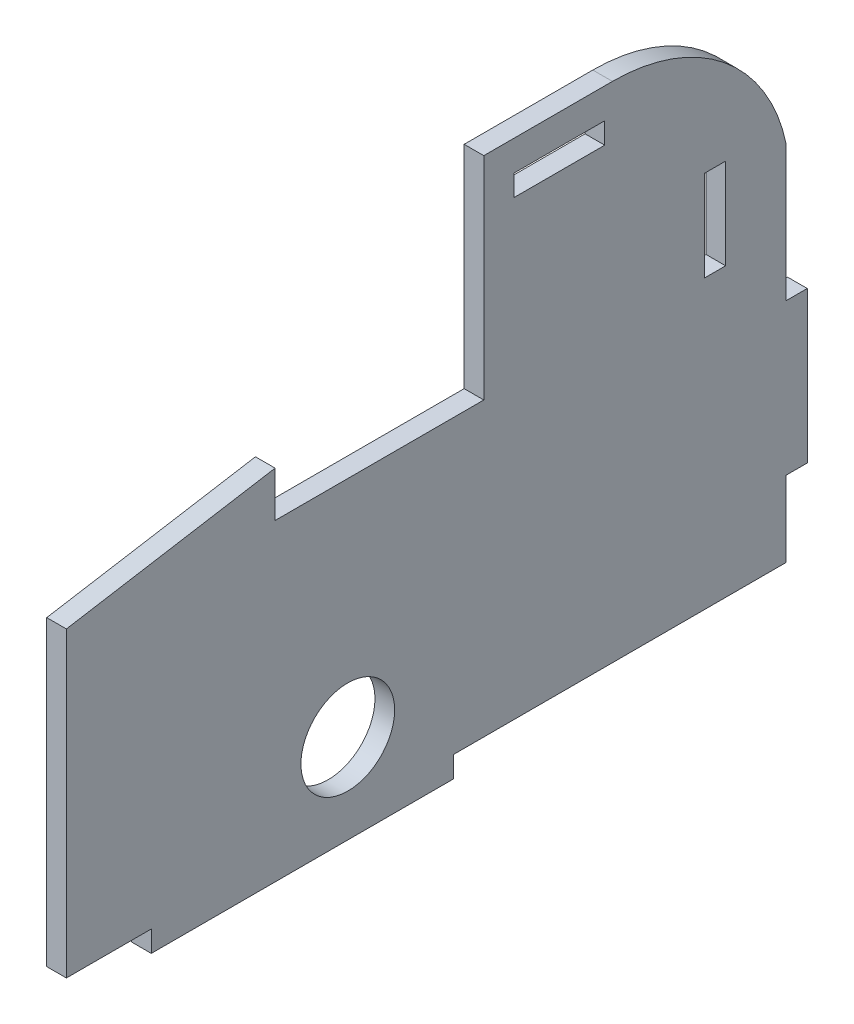
ISO-10303-21;
HEADER;
FILE_DESCRIPTION(('STEP AP214'),'2;1');
FILE_NAME('part.step','',(''),(''),'','','');
FILE_SCHEMA(('AUTOMOTIVE_DESIGN { 1 0 10303 214 1 1 1 1 }'));
ENDSEC;
DATA;
#1=APPLICATION_CONTEXT('core data for automotive mechanical design processes');
#2=APPLICATION_PROTOCOL_DEFINITION('international standard','automotive_design',2000,#1);
#3=PRODUCT_CONTEXT('',#1,'mechanical');
#4=PRODUCT('Part','Part','',(#3));
#5=PRODUCT_RELATED_PRODUCT_CATEGORY('part','',(#4));
#6=PRODUCT_DEFINITION_FORMATION('','',#4);
#7=PRODUCT_DEFINITION_CONTEXT('part definition',#1,'design');
#8=PRODUCT_DEFINITION('design','',#6,#7);
#9=PRODUCT_DEFINITION_SHAPE('','',#8);
#10=(LENGTH_UNIT() NAMED_UNIT(*) SI_UNIT(.MILLI.,.METRE.));
#11=(NAMED_UNIT(*) PLANE_ANGLE_UNIT() SI_UNIT($,.RADIAN.));
#12=(NAMED_UNIT(*) SI_UNIT($,.STERADIAN.) SOLID_ANGLE_UNIT());
#13=UNCERTAINTY_MEASURE_WITH_UNIT(LENGTH_MEASURE(1.E-05),#10,'distance_accuracy_value','');
#14=(GEOMETRIC_REPRESENTATION_CONTEXT(3) GLOBAL_UNCERTAINTY_ASSIGNED_CONTEXT((#13)) GLOBAL_UNIT_ASSIGNED_CONTEXT((#10,
#11,#12)) REPRESENTATION_CONTEXT('',''));
#15=CARTESIAN_POINT('',(0.,0.,0.));
#16=DIRECTION('',(0.,0.,1.));
#17=DIRECTION('',(1.,0.,0.));
#18=AXIS2_PLACEMENT_3D('',#15,#16,#17);
#19=CARTESIAN_POINT('',(1.3,24.,-16.3874151755906));
#20=DIRECTION('',(0.,0.,1.));
#21=DIRECTION('',(1.,0.,0.));
#22=AXIS2_PLACEMENT_3D('',#19,#20,#21);
#23=PLANE('',#22);
#24=DIRECTION('',(1.,0.,0.));
#25=VECTOR('',#24,1.);
#26=CARTESIAN_POINT('',(0.,15.,-16.3874151755906));
#27=LINE('',#26,#25);
#28=CARTESIAN_POINT('',(0.,15.,-16.3874151755906));
#29=VERTEX_POINT('',#28);
#30=CARTESIAN_POINT('',(1.3,15.,-16.3874151755906));
#31=VERTEX_POINT('',#30);
#32=EDGE_CURVE('E246',#29,#31,#27,.T.);
#33=ORIENTED_EDGE('',*,*,#32,.F.);
#34=DIRECTION('',(0.,1.,0.));
#35=VECTOR('',#34,1.);
#36=CARTESIAN_POINT('',(0.,24.,-16.3874151755906));
#37=LINE('',#36,#35);
#38=CARTESIAN_POINT('',(0.,24.,-16.3874151755906));
#39=VERTEX_POINT('',#38);
#40=EDGE_CURVE('E359',#29,#39,#37,.T.);
#41=ORIENTED_EDGE('',*,*,#40,.T.);
#42=DIRECTION('',(-1.,0.,0.));
#43=VECTOR('',#42,1.);
#44=CARTESIAN_POINT('',(1.3,24.,-16.3874151755906));
#45=LINE('',#44,#43);
#46=CARTESIAN_POINT('',(1.3,24.,-16.3874151755906));
#47=VERTEX_POINT('',#46);
#48=EDGE_CURVE('E48',#47,#39,#45,.T.);
#49=ORIENTED_EDGE('',*,*,#48,.F.);
#50=DIRECTION('',(0.,1.,0.));
#51=VECTOR('',#50,1.);
#52=CARTESIAN_POINT('',(1.3,24.,-16.3874151755906));
#53=LINE('',#52,#51);
#54=EDGE_CURVE('E336',#31,#47,#53,.T.);
#55=ORIENTED_EDGE('',*,*,#54,.F.);
#56=EDGE_LOOP('',(#33,#41,#49,#55));
#57=FACE_BOUND('',#56,.T.);
#58=ADVANCED_FACE('F40',(#57),#23,.F.);
#59=CARTESIAN_POINT('',(1.3,0.,-16.3874151755906));
#60=DIRECTION('',(0.,1.,0.));
#61=DIRECTION('',(0.,0.,1.));
#62=AXIS2_PLACEMENT_3D('',#59,#60,#61);
#63=PLANE('',#62);
#64=DIRECTION('',(1.,0.,0.));
#65=VECTOR('',#64,1.);
#66=CARTESIAN_POINT('',(0.,0.,5.61258482440937));
#67=LINE('',#66,#65);
#68=CARTESIAN_POINT('',(0.,0.,5.61258482440937));
#69=VERTEX_POINT('',#68);
#70=CARTESIAN_POINT('',(1.3,0.,5.61258482440937));
#71=VERTEX_POINT('',#70);
#72=EDGE_CURVE('E328',#69,#71,#67,.T.);
#73=ORIENTED_EDGE('',*,*,#72,.F.);
#74=DIRECTION('',(0.,0.,-1.));
#75=VECTOR('',#74,1.);
#76=CARTESIAN_POINT('',(0.,0.,-16.3874151755906));
#77=LINE('',#76,#75);
#78=CARTESIAN_POINT('',(0.,0.,-16.3874151755906));
#79=VERTEX_POINT('',#78);
#80=EDGE_CURVE('E327',#69,#79,#77,.T.);
#81=ORIENTED_EDGE('',*,*,#80,.T.);
#82=DIRECTION('',(-1.,0.,0.));
#83=VECTOR('',#82,1.);
#84=CARTESIAN_POINT('',(1.3,0.,-16.3874151755906));
#85=LINE('',#84,#83);
#86=CARTESIAN_POINT('',(1.3,0.,-16.3874151755906));
#87=VERTEX_POINT('',#86);
#88=EDGE_CURVE('E11',#87,#79,#85,.T.);
#89=ORIENTED_EDGE('',*,*,#88,.F.);
#90=DIRECTION('',(0.,0.,-1.));
#91=VECTOR('',#90,1.);
#92=CARTESIAN_POINT('',(1.3,0.,0.));
#93=LINE('',#92,#91);
#94=EDGE_CURVE('E337',#71,#87,#93,.T.);
#95=ORIENTED_EDGE('',*,*,#94,.F.);
#96=EDGE_LOOP('',(#73,#81,#89,#95));
#97=FACE_BOUND('',#96,.T.);
#98=ADVANCED_FACE('F443',(#97),#63,.F.);
#99=CARTESIAN_POINT('',(0.,0.,31.2285816674518));
#100=VERTEX_POINT('',#99);
#101=CARTESIAN_POINT('',(0.,0.,25.6125848244094));
#102=VERTEX_POINT('',#101);
#103=EDGE_CURVE('E356',#100,#102,#77,.T.);
#104=ORIENTED_EDGE('',*,*,#103,.T.);
#105=DIRECTION('',(1.,0.,0.));
#106=VECTOR('',#105,1.);
#107=CARTESIAN_POINT('',(0.,0.,25.6125848244094));
#108=LINE('',#107,#106);
#109=CARTESIAN_POINT('',(1.3,0.,25.6125848244094));
#110=VERTEX_POINT('',#109);
#111=EDGE_CURVE('E324',#102,#110,#108,.T.);
#112=ORIENTED_EDGE('',*,*,#111,.T.);
#113=CARTESIAN_POINT('',(1.3,0.,31.2285816674518));
#114=VERTEX_POINT('',#113);
#115=EDGE_CURVE('E333',#114,#110,#93,.T.);
#116=ORIENTED_EDGE('',*,*,#115,.F.);
#117=DIRECTION('',(-1.,0.,0.));
#118=VECTOR('',#117,1.);
#119=CARTESIAN_POINT('',(1.3,0.,31.2285816674518));
#120=LINE('',#119,#118);
#121=EDGE_CURVE('E355',#114,#100,#120,.T.);
#122=ORIENTED_EDGE('',*,*,#121,.T.);
#123=EDGE_LOOP('',(#104,#112,#116,#122));
#124=FACE_BOUND('',#123,.T.);
#125=ADVANCED_FACE('F42',(#124),#63,.F.);
#126=CARTESIAN_POINT('',(0.,5.,-16.3874151755906));
#127=VERTEX_POINT('',#126);
#128=EDGE_CURVE('E360',#79,#127,#37,.T.);
#129=ORIENTED_EDGE('',*,*,#128,.T.);
#130=DIRECTION('',(1.,0.,0.));
#131=VECTOR('',#130,1.);
#132=CARTESIAN_POINT('',(0.,5.,-16.3874151755906));
#133=LINE('',#132,#131);
#134=CARTESIAN_POINT('',(1.3,5.,-16.3874151755906));
#135=VERTEX_POINT('',#134);
#136=EDGE_CURVE('E281',#127,#135,#133,.T.);
#137=ORIENTED_EDGE('',*,*,#136,.T.);
#138=EDGE_CURVE('E338',#87,#135,#53,.T.);
#139=ORIENTED_EDGE('',*,*,#138,.F.);
#140=ORIENTED_EDGE('',*,*,#88,.T.);
#141=EDGE_LOOP('',(#129,#137,#139,#140));
#142=FACE_BOUND('',#141,.T.);
#143=ADVANCED_FACE('F437',(#142),#23,.F.);
#144=CARTESIAN_POINT('',(1.3,21.5670962182213,-4.89861968911437));
#145=DIRECTION('',(-1.,0.,0.));
#146=DIRECTION('',(0.,0.,1.));
#147=AXIS2_PLACEMENT_3D('',#144,#145,#146);
#148=CYLINDRICAL_SURFACE('',#147,11.7435702638282);
#149=CARTESIAN_POINT('',(0.,21.5670962182213,-4.89861968911437));
#150=DIRECTION('',(1.,0.,0.));
#151=DIRECTION('',(0.,0.,1.));
#152=AXIS2_PLACEMENT_3D('',#149,#150,#151);
#153=CIRCLE('',#152,11.7435702638282);
#154=CARTESIAN_POINT('',(0.,33.3106664820495,-4.89861968911437));
#155=VERTEX_POINT('',#154);
#156=EDGE_CURVE('E363',#39,#155,#153,.T.);
#157=ORIENTED_EDGE('',*,*,#156,.T.);
#158=DIRECTION('',(-1.,0.,0.));
#159=VECTOR('',#158,1.);
#160=CARTESIAN_POINT('',(1.3,33.3106664820495,-4.89861968911437));
#161=LINE('',#160,#159);
#162=CARTESIAN_POINT('',(1.3,33.3106664820495,-4.89861968911437));
#163=VERTEX_POINT('',#162);
#164=EDGE_CURVE('E395',#163,#155,#161,.T.);
#165=ORIENTED_EDGE('',*,*,#164,.F.);
#166=CARTESIAN_POINT('',(1.3,21.5670962182213,-4.89861968911437));
#167=DIRECTION('',(1.,0.,0.));
#168=DIRECTION('',(0.,0.,1.));
#169=AXIS2_PLACEMENT_3D('',#166,#167,#168);
#170=CIRCLE('',#169,11.7435702638282);
#171=EDGE_CURVE('E341',#47,#163,#170,.T.);
#172=ORIENTED_EDGE('',*,*,#171,.F.);
#173=ORIENTED_EDGE('',*,*,#48,.T.);
#174=EDGE_LOOP('',(#157,#165,#172,#173));
#175=FACE_BOUND('',#174,.T.);
#176=ADVANCED_FACE('F402',(#175),#148,.T.);
#177=CARTESIAN_POINT('',(1.3,33.3106664820495,3.61258482440937));
#178=DIRECTION('',(0.,-1.,0.));
#179=DIRECTION('',(0.,0.,-1.));
#180=AXIS2_PLACEMENT_3D('',#177,#178,#179);
#181=PLANE('',#180);
#182=DIRECTION('',(0.,0.,1.));
#183=VECTOR('',#182,1.);
#184=CARTESIAN_POINT('',(0.,33.3106664820495,3.61258482440937));
#185=LINE('',#184,#183);
#186=CARTESIAN_POINT('',(0.,33.3106664820495,3.61258482440937));
#187=VERTEX_POINT('',#186);
#188=EDGE_CURVE('E365',#155,#187,#185,.T.);
#189=ORIENTED_EDGE('',*,*,#188,.T.);
#190=DIRECTION('',(-1.,0.,0.));
#191=VECTOR('',#190,1.);
#192=CARTESIAN_POINT('',(1.3,33.3106664820495,3.61258482440937));
#193=LINE('',#192,#191);
#194=CARTESIAN_POINT('',(1.3,33.3106664820495,3.61258482440937));
#195=VERTEX_POINT('',#194);
#196=EDGE_CURVE('E392',#195,#187,#193,.T.);
#197=ORIENTED_EDGE('',*,*,#196,.F.);
#198=DIRECTION('',(0.,0.,1.));
#199=VECTOR('',#198,1.);
#200=CARTESIAN_POINT('',(1.3,33.3106664820495,3.61258482440937));
#201=LINE('',#200,#199);
#202=EDGE_CURVE('E343',#163,#195,#201,.T.);
#203=ORIENTED_EDGE('',*,*,#202,.F.);
#204=ORIENTED_EDGE('',*,*,#164,.T.);
#205=EDGE_LOOP('',(#189,#197,#203,#204));
#206=FACE_BOUND('',#205,.T.);
#207=ADVANCED_FACE('F414',(#206),#181,.F.);
#208=CARTESIAN_POINT('',(1.3,19.3106664820495,3.61258482440937));
#209=DIRECTION('',(0.,0.,-1.));
#210=DIRECTION('',(0.,1.,0.));
#211=AXIS2_PLACEMENT_3D('',#208,#209,#210);
#212=PLANE('',#211);
#213=DIRECTION('',(0.,-1.,0.));
#214=VECTOR('',#213,1.);
#215=CARTESIAN_POINT('',(0.,19.3106664820495,3.61258482440937));
#216=LINE('',#215,#214);
#217=CARTESIAN_POINT('',(0.,19.3106664820495,3.61258482440937));
#218=VERTEX_POINT('',#217);
#219=EDGE_CURVE('E367',#187,#218,#216,.T.);
#220=ORIENTED_EDGE('',*,*,#219,.T.);
#221=DIRECTION('',(-1.,0.,0.));
#222=VECTOR('',#221,1.);
#223=CARTESIAN_POINT('',(1.3,19.3106664820495,3.61258482440937));
#224=LINE('',#223,#222);
#225=CARTESIAN_POINT('',(1.3,19.3106664820495,3.61258482440937));
#226=VERTEX_POINT('',#225);
#227=EDGE_CURVE('E389',#226,#218,#224,.T.);
#228=ORIENTED_EDGE('',*,*,#227,.F.);
#229=DIRECTION('',(0.,-1.,0.));
#230=VECTOR('',#229,1.);
#231=CARTESIAN_POINT('',(1.3,19.3106664820495,3.61258482440937));
#232=LINE('',#231,#230);
#233=EDGE_CURVE('E345',#195,#226,#232,.T.);
#234=ORIENTED_EDGE('',*,*,#233,.F.);
#235=ORIENTED_EDGE('',*,*,#196,.T.);
#236=EDGE_LOOP('',(#220,#228,#234,#235));
#237=FACE_BOUND('',#236,.T.);
#238=ADVANCED_FACE('F418',(#237),#212,.F.);
#239=CARTESIAN_POINT('',(1.3,19.3106664820495,17.4205832459306));
#240=DIRECTION('',(0.,-1.,0.));
#241=DIRECTION('',(0.,0.,-1.));
#242=AXIS2_PLACEMENT_3D('',#239,#240,#241);
#243=PLANE('',#242);
#244=DIRECTION('',(0.,0.,1.));
#245=VECTOR('',#244,1.);
#246=CARTESIAN_POINT('',(0.,19.3106664820495,17.4205832459306));
#247=LINE('',#246,#245);
#248=CARTESIAN_POINT('',(0.,19.3106664820495,17.4205832459306));
#249=VERTEX_POINT('',#248);
#250=EDGE_CURVE('E369',#218,#249,#247,.T.);
#251=ORIENTED_EDGE('',*,*,#250,.T.);
#252=DIRECTION('',(-1.,0.,0.));
#253=VECTOR('',#252,1.);
#254=CARTESIAN_POINT('',(1.3,19.3106664820495,17.4205832459306));
#255=LINE('',#254,#253);
#256=CARTESIAN_POINT('',(1.3,19.3106664820495,17.4205832459306));
#257=VERTEX_POINT('',#256);
#258=EDGE_CURVE('E386',#257,#249,#255,.T.);
#259=ORIENTED_EDGE('',*,*,#258,.F.);
#260=DIRECTION('',(0.,0.,1.));
#261=VECTOR('',#260,1.);
#262=CARTESIAN_POINT('',(1.3,19.3106664820495,17.4205832459306));
#263=LINE('',#262,#261);
#264=EDGE_CURVE('E347',#226,#257,#263,.T.);
#265=ORIENTED_EDGE('',*,*,#264,.F.);
#266=ORIENTED_EDGE('',*,*,#227,.T.);
#267=EDGE_LOOP('',(#251,#259,#265,#266));
#268=FACE_BOUND('',#267,.T.);
#269=ADVANCED_FACE('F472',(#268),#243,.F.);
#270=CARTESIAN_POINT('',(1.3,22.3106664820495,17.4205832459306));
#271=DIRECTION('',(0.,0.,1.));
#272=DIRECTION('',(0.,-1.,0.));
#273=AXIS2_PLACEMENT_3D('',#270,#271,#272);
#274=PLANE('',#273);
#275=DIRECTION('',(0.,1.,0.));
#276=VECTOR('',#275,1.);
#277=CARTESIAN_POINT('',(0.,22.3106664820495,17.4205832459306));
#278=LINE('',#277,#276);
#279=CARTESIAN_POINT('',(0.,22.3106664820495,17.4205832459306));
#280=VERTEX_POINT('',#279);
#281=EDGE_CURVE('E371',#249,#280,#278,.T.);
#282=ORIENTED_EDGE('',*,*,#281,.T.);
#283=DIRECTION('',(-1.,0.,0.));
#284=VECTOR('',#283,1.);
#285=CARTESIAN_POINT('',(1.3,22.3106664820495,17.4205832459306));
#286=LINE('',#285,#284);
#287=CARTESIAN_POINT('',(1.3,22.3106664820495,17.4205832459306));
#288=VERTEX_POINT('',#287);
#289=EDGE_CURVE('E383',#288,#280,#286,.T.);
#290=ORIENTED_EDGE('',*,*,#289,.F.);
#291=DIRECTION('',(0.,1.,0.));
#292=VECTOR('',#291,1.);
#293=CARTESIAN_POINT('',(1.3,22.3106664820495,17.4205832459306));
#294=LINE('',#293,#292);
#295=EDGE_CURVE('E349',#257,#288,#294,.T.);
#296=ORIENTED_EDGE('',*,*,#295,.F.);
#297=ORIENTED_EDGE('',*,*,#258,.T.);
#298=EDGE_LOOP('',(#282,#290,#296,#297));
#299=FACE_BOUND('',#298,.T.);
#300=ADVANCED_FACE('F470',(#299),#274,.F.);
#301=CARTESIAN_POINT('',(1.3,20.,31.2285816674518));
#302=DIRECTION('',(0.,-0.986285601537231,-0.165047605860678));
#303=DIRECTION('',(0.,0.165047605860678,-0.986285601537232));
#304=AXIS2_PLACEMENT_3D('',#301,#302,#303);
#305=PLANE('',#304);
#306=DIRECTION('',(0.,-0.165047605860678,0.986285601537231));
#307=VECTOR('',#306,1.);
#308=CARTESIAN_POINT('',(0.,20.,31.2285816674518));
#309=LINE('',#308,#307);
#310=CARTESIAN_POINT('',(0.,20.,31.2285816674518));
#311=VERTEX_POINT('',#310);
#312=EDGE_CURVE('E373',#280,#311,#309,.T.);
#313=ORIENTED_EDGE('',*,*,#312,.T.);
#314=DIRECTION('',(-1.,0.,0.));
#315=VECTOR('',#314,1.);
#316=CARTESIAN_POINT('',(1.3,20.,31.2285816674518));
#317=LINE('',#316,#315);
#318=CARTESIAN_POINT('',(1.3,20.,31.2285816674518));
#319=VERTEX_POINT('',#318);
#320=EDGE_CURVE('E380',#319,#311,#317,.T.);
#321=ORIENTED_EDGE('',*,*,#320,.F.);
#322=DIRECTION('',(0.,-0.165047605860678,0.986285601537231));
#323=VECTOR('',#322,1.);
#324=CARTESIAN_POINT('',(1.3,20.,31.2285816674518));
#325=LINE('',#324,#323);
#326=EDGE_CURVE('E351',#288,#319,#325,.T.);
#327=ORIENTED_EDGE('',*,*,#326,.F.);
#328=ORIENTED_EDGE('',*,*,#289,.T.);
#329=EDGE_LOOP('',(#313,#321,#327,#328));
#330=FACE_BOUND('',#329,.T.);
#331=ADVANCED_FACE('F465',(#330),#305,.F.);
#332=CARTESIAN_POINT('',(1.3,0.,31.2285816674518));
#333=DIRECTION('',(0.,0.,-1.));
#334=DIRECTION('',(-1.,0.,0.));
#335=AXIS2_PLACEMENT_3D('',#332,#333,#334);
#336=PLANE('',#335);
#337=DIRECTION('',(0.,-1.,0.));
#338=VECTOR('',#337,1.);
#339=CARTESIAN_POINT('',(0.,0.,31.2285816674518));
#340=LINE('',#339,#338);
#341=EDGE_CURVE('E375',#311,#100,#340,.T.);
#342=ORIENTED_EDGE('',*,*,#341,.T.);
#343=ORIENTED_EDGE('',*,*,#121,.F.);
#344=DIRECTION('',(0.,-1.,0.));
#345=VECTOR('',#344,1.);
#346=CARTESIAN_POINT('',(1.3,0.,31.2285816674518));
#347=LINE('',#346,#345);
#348=EDGE_CURVE('E353',#319,#114,#347,.T.);
#349=ORIENTED_EDGE('',*,*,#348,.F.);
#350=ORIENTED_EDGE('',*,*,#320,.T.);
#351=EDGE_LOOP('',(#342,#343,#349,#350));
#352=FACE_BOUND('',#351,.T.);
#353=ADVANCED_FACE('F460',(#352),#336,.F.);
#354=CARTESIAN_POINT('',(1.3,21.5670962182213,-4.89861968911437));
#355=DIRECTION('',(-1.,0.,0.));
#356=DIRECTION('',(0.,0.,1.));
#357=AXIS2_PLACEMENT_3D('',#354,#355,#356);
#358=PLANE('',#357);
#359=CARTESIAN_POINT('',(1.3,4.5,12.6125848244094));
#360=DIRECTION('',(1.,0.,0.));
#361=DIRECTION('',(0.,0.,-1.));
#362=AXIS2_PLACEMENT_3D('',#359,#360,#361);
#363=CIRCLE('',#362,3.1);
#364=CARTESIAN_POINT('',(1.3,4.5,9.51258482440937));
#365=VERTEX_POINT('',#364);
#366=EDGE_CURVE('E234',#365,#365,#363,.T.);
#367=ORIENTED_EDGE('',*,*,#366,.F.);
#368=EDGE_LOOP('',(#367));
#369=FACE_BOUND('',#368,.T.);
#370=DIRECTION('',(0.,0.,-1.));
#371=VECTOR('',#370,1.);
#372=CARTESIAN_POINT('',(1.3,29.9106664820495,1.61258482440937));
#373=LINE('',#372,#371);
#374=CARTESIAN_POINT('',(1.3,29.9106664820495,1.61258482440937));
#375=VERTEX_POINT('',#374);
#376=CARTESIAN_POINT('',(1.3,29.9106664820495,-4.38741517559063));
#377=VERTEX_POINT('',#376);
#378=EDGE_CURVE('E240',#375,#377,#373,.T.);
#379=ORIENTED_EDGE('',*,*,#378,.F.);
#380=DIRECTION('',(0.,-1.,0.));
#381=VECTOR('',#380,1.);
#382=CARTESIAN_POINT('',(1.3,31.3106664820495,1.61258482440937));
#383=LINE('',#382,#381);
#384=CARTESIAN_POINT('',(1.3,31.3106664820495,1.61258482440937));
#385=VERTEX_POINT('',#384);
#386=EDGE_CURVE('E55',#385,#375,#383,.T.);
#387=ORIENTED_EDGE('',*,*,#386,.F.);
#388=DIRECTION('',(0.,0.,1.));
#389=VECTOR('',#388,1.);
#390=CARTESIAN_POINT('',(1.3,31.3106664820495,1.61258482440937));
#391=LINE('',#390,#389);
#392=CARTESIAN_POINT('',(1.3,31.3106664820495,-4.38741517559063));
#393=VERTEX_POINT('',#392);
#394=EDGE_CURVE('E228',#393,#385,#391,.T.);
#395=ORIENTED_EDGE('',*,*,#394,.F.);
#396=DIRECTION('',(0.,1.,0.));
#397=VECTOR('',#396,1.);
#398=CARTESIAN_POINT('',(1.3,31.3106664820495,-4.38741517559063));
#399=LINE('',#398,#397);
#400=EDGE_CURVE('E231',#377,#393,#399,.T.);
#401=ORIENTED_EDGE('',*,*,#400,.F.);
#402=EDGE_LOOP('',(#379,#387,#395,#401));
#403=FACE_BOUND('',#402,.T.);
#404=DIRECTION('',(0.,0.,-1.));
#405=VECTOR('',#404,1.);
#406=CARTESIAN_POINT('',(1.3,19.,-10.9874151755906));
#407=LINE('',#406,#405);
#408=CARTESIAN_POINT('',(1.3,19.,-10.9874151755906));
#409=VERTEX_POINT('',#408);
#410=CARTESIAN_POINT('',(1.3,19.,-12.3874151755906));
#411=VERTEX_POINT('',#410);
#412=EDGE_CURVE('E267',#409,#411,#407,.T.);
#413=ORIENTED_EDGE('',*,*,#412,.F.);
#414=DIRECTION('',(0.,-1.,0.));
#415=VECTOR('',#414,1.);
#416=CARTESIAN_POINT('',(1.3,25.,-10.9874151755906));
#417=LINE('',#416,#415);
#418=CARTESIAN_POINT('',(1.3,25.,-10.9874151755906));
#419=VERTEX_POINT('',#418);
#420=EDGE_CURVE('E63',#419,#409,#417,.T.);
#421=ORIENTED_EDGE('',*,*,#420,.F.);
#422=DIRECTION('',(0.,0.,1.));
#423=VECTOR('',#422,1.);
#424=CARTESIAN_POINT('',(1.3,25.,-10.9874151755906));
#425=LINE('',#424,#423);
#426=CARTESIAN_POINT('',(1.3,25.,-12.3874151755906));
#427=VERTEX_POINT('',#426);
#428=EDGE_CURVE('E260',#427,#419,#425,.T.);
#429=ORIENTED_EDGE('',*,*,#428,.F.);
#430=DIRECTION('',(0.,1.,0.));
#431=VECTOR('',#430,1.);
#432=CARTESIAN_POINT('',(1.3,25.,-12.3874151755906));
#433=LINE('',#432,#431);
#434=EDGE_CURVE('E263',#411,#427,#433,.T.);
#435=ORIENTED_EDGE('',*,*,#434,.F.);
#436=EDGE_LOOP('',(#413,#421,#429,#435));
#437=FACE_BOUND('',#436,.T.);
#438=ORIENTED_EDGE('',*,*,#115,.T.);
#439=DIRECTION('',(0.,-1.,0.));
#440=VECTOR('',#439,1.);
#441=CARTESIAN_POINT('',(1.3,0.,25.6125848244094));
#442=LINE('',#441,#440);
#443=CARTESIAN_POINT('',(1.3,-1.4,25.6125848244094));
#444=VERTEX_POINT('',#443);
#445=EDGE_CURVE('E300',#110,#444,#442,.T.);
#446=ORIENTED_EDGE('',*,*,#445,.T.);
#447=DIRECTION('',(0.,0.,-1.));
#448=VECTOR('',#447,1.);
#449=CARTESIAN_POINT('',(1.3,-1.4,25.6125848244094));
#450=LINE('',#449,#448);
#451=CARTESIAN_POINT('',(1.3,-1.4,5.61258482440937));
#452=VERTEX_POINT('',#451);
#453=EDGE_CURVE('E319',#444,#452,#450,.T.);
#454=ORIENTED_EDGE('',*,*,#453,.T.);
#455=DIRECTION('',(0.,1.,0.));
#456=VECTOR('',#455,1.);
#457=CARTESIAN_POINT('',(1.3,0.,5.61258482440937));
#458=LINE('',#457,#456);
#459=EDGE_CURVE('E311',#452,#71,#458,.T.);
#460=ORIENTED_EDGE('',*,*,#459,.T.);
#461=ORIENTED_EDGE('',*,*,#94,.T.);
#462=ORIENTED_EDGE('',*,*,#138,.T.);
#463=DIRECTION('',(0.,0.,-1.));
#464=VECTOR('',#463,1.);
#465=CARTESIAN_POINT('',(1.3,5.,-16.3874151755906));
#466=LINE('',#465,#464);
#467=CARTESIAN_POINT('',(1.3,5.,-17.7874151755906));
#468=VERTEX_POINT('',#467);
#469=EDGE_CURVE('E297',#135,#468,#466,.T.);
#470=ORIENTED_EDGE('',*,*,#469,.T.);
#471=DIRECTION('',(0.,1.,0.));
#472=VECTOR('',#471,1.);
#473=CARTESIAN_POINT('',(1.3,15.,-17.7874151755906));
#474=LINE('',#473,#472);
#475=CARTESIAN_POINT('',(1.3,15.,-17.7874151755906));
#476=VERTEX_POINT('',#475);
#477=EDGE_CURVE('E293',#468,#476,#474,.T.);
#478=ORIENTED_EDGE('',*,*,#477,.T.);
#479=DIRECTION('',(0.,0.,1.));
#480=VECTOR('',#479,1.);
#481=CARTESIAN_POINT('',(1.3,15.,-16.3874151755906));
#482=LINE('',#481,#480);
#483=EDGE_CURVE('E290',#476,#31,#482,.T.);
#484=ORIENTED_EDGE('',*,*,#483,.T.);
#485=ORIENTED_EDGE('',*,*,#54,.T.);
#486=ORIENTED_EDGE('',*,*,#171,.T.);
#487=ORIENTED_EDGE('',*,*,#202,.T.);
#488=ORIENTED_EDGE('',*,*,#233,.T.);
#489=ORIENTED_EDGE('',*,*,#264,.T.);
#490=ORIENTED_EDGE('',*,*,#295,.T.);
#491=ORIENTED_EDGE('',*,*,#326,.T.);
#492=ORIENTED_EDGE('',*,*,#348,.T.);
#493=EDGE_LOOP('',(#438,#446,#454,#460,#461,#462,#470,#478,#484,#485,#486,#487,#488,#489,#490,
#491,#492));
#494=FACE_BOUND('',#493,.T.);
#495=ADVANCED_FACE('F422',(#369,#403,#437,#494),#358,.F.);
#496=CARTESIAN_POINT('',(0.,21.5670962182213,-4.89861968911437));
#497=DIRECTION('',(-1.,0.,0.));
#498=DIRECTION('',(0.,0.,1.));
#499=AXIS2_PLACEMENT_3D('',#496,#497,#498);
#500=PLANE('',#499);
#501=CARTESIAN_POINT('',(0.,4.5,12.6125848244094));
#502=DIRECTION('',(1.,0.,0.));
#503=DIRECTION('',(0.,0.,-1.));
#504=AXIS2_PLACEMENT_3D('',#501,#502,#503);
#505=CIRCLE('',#504,3.1);
#506=CARTESIAN_POINT('',(0.,4.5,9.51258482440937));
#507=VERTEX_POINT('',#506);
#508=EDGE_CURVE('E259',#507,#507,#505,.T.);
#509=ORIENTED_EDGE('',*,*,#508,.T.);
#510=EDGE_LOOP('',(#509));
#511=FACE_BOUND('',#510,.T.);
#512=DIRECTION('',(0.,-1.,0.));
#513=VECTOR('',#512,1.);
#514=CARTESIAN_POINT('',(0.,31.3106664820495,1.61258482440937));
#515=LINE('',#514,#513);
#516=CARTESIAN_POINT('',(0.,31.3106664820495,1.61258482440937));
#517=VERTEX_POINT('',#516);
#518=CARTESIAN_POINT('',(0.,29.9106664820495,1.61258482440937));
#519=VERTEX_POINT('',#518);
#520=EDGE_CURVE('E209',#517,#519,#515,.T.);
#521=ORIENTED_EDGE('',*,*,#520,.T.);
#522=DIRECTION('',(0.,0.,-1.));
#523=VECTOR('',#522,1.);
#524=CARTESIAN_POINT('',(0.,29.9106664820495,1.61258482440937));
#525=LINE('',#524,#523);
#526=CARTESIAN_POINT('',(0.,29.9106664820495,-4.38741517559063));
#527=VERTEX_POINT('',#526);
#528=EDGE_CURVE('E219',#519,#527,#525,.T.);
#529=ORIENTED_EDGE('',*,*,#528,.T.);
#530=DIRECTION('',(0.,1.,0.));
#531=VECTOR('',#530,1.);
#532=CARTESIAN_POINT('',(0.,31.3106664820495,-4.38741517559063));
#533=LINE('',#532,#531);
#534=CARTESIAN_POINT('',(0.,31.3106664820495,-4.38741517559063));
#535=VERTEX_POINT('',#534);
#536=EDGE_CURVE('E223',#527,#535,#533,.T.);
#537=ORIENTED_EDGE('',*,*,#536,.T.);
#538=DIRECTION('',(0.,0.,1.));
#539=VECTOR('',#538,1.);
#540=CARTESIAN_POINT('',(0.,31.3106664820495,1.61258482440937));
#541=LINE('',#540,#539);
#542=EDGE_CURVE('E215',#535,#517,#541,.T.);
#543=ORIENTED_EDGE('',*,*,#542,.T.);
#544=EDGE_LOOP('',(#521,#529,#537,#543));
#545=FACE_BOUND('',#544,.T.);
#546=DIRECTION('',(0.,-1.,0.));
#547=VECTOR('',#546,1.);
#548=CARTESIAN_POINT('',(0.,25.,-10.9874151755906));
#549=LINE('',#548,#547);
#550=CARTESIAN_POINT('',(0.,25.,-10.9874151755906));
#551=VERTEX_POINT('',#550);
#552=CARTESIAN_POINT('',(0.,19.,-10.9874151755906));
#553=VERTEX_POINT('',#552);
#554=EDGE_CURVE('E264',#551,#553,#549,.T.);
#555=ORIENTED_EDGE('',*,*,#554,.T.);
#556=DIRECTION('',(0.,0.,-1.));
#557=VECTOR('',#556,1.);
#558=CARTESIAN_POINT('',(0.,19.,-10.9874151755906));
#559=LINE('',#558,#557);
#560=CARTESIAN_POINT('',(0.,19.,-12.3874151755906));
#561=VERTEX_POINT('',#560);
#562=EDGE_CURVE('E276',#553,#561,#559,.T.);
#563=ORIENTED_EDGE('',*,*,#562,.T.);
#564=DIRECTION('',(0.,1.,0.));
#565=VECTOR('',#564,1.);
#566=CARTESIAN_POINT('',(0.,25.,-12.3874151755906));
#567=LINE('',#566,#565);
#568=CARTESIAN_POINT('',(0.,25.,-12.3874151755906));
#569=VERTEX_POINT('',#568);
#570=EDGE_CURVE('E273',#561,#569,#567,.T.);
#571=ORIENTED_EDGE('',*,*,#570,.T.);
#572=DIRECTION('',(0.,0.,1.));
#573=VECTOR('',#572,1.);
#574=CARTESIAN_POINT('',(0.,25.,-10.9874151755906));
#575=LINE('',#574,#573);
#576=EDGE_CURVE('E252',#569,#551,#575,.T.);
#577=ORIENTED_EDGE('',*,*,#576,.T.);
#578=EDGE_LOOP('',(#555,#563,#571,#577));
#579=FACE_BOUND('',#578,.T.);
#580=ORIENTED_EDGE('',*,*,#103,.F.);
#581=ORIENTED_EDGE('',*,*,#341,.F.);
#582=ORIENTED_EDGE('',*,*,#312,.F.);
#583=ORIENTED_EDGE('',*,*,#281,.F.);
#584=ORIENTED_EDGE('',*,*,#250,.F.);
#585=ORIENTED_EDGE('',*,*,#219,.F.);
#586=ORIENTED_EDGE('',*,*,#188,.F.);
#587=ORIENTED_EDGE('',*,*,#156,.F.);
#588=ORIENTED_EDGE('',*,*,#40,.F.);
#589=DIRECTION('',(0.,0.,1.));
#590=VECTOR('',#589,1.);
#591=CARTESIAN_POINT('',(0.,15.,-16.3874151755906));
#592=LINE('',#591,#590);
#593=CARTESIAN_POINT('',(0.,15.,-17.7874151755906));
#594=VERTEX_POINT('',#593);
#595=EDGE_CURVE('E284',#594,#29,#592,.T.);
#596=ORIENTED_EDGE('',*,*,#595,.F.);
#597=DIRECTION('',(0.,1.,0.));
#598=VECTOR('',#597,1.);
#599=CARTESIAN_POINT('',(0.,15.,-17.7874151755906));
#600=LINE('',#599,#598);
#601=CARTESIAN_POINT('',(0.,5.,-17.7874151755906));
#602=VERTEX_POINT('',#601);
#603=EDGE_CURVE('E302',#602,#594,#600,.T.);
#604=ORIENTED_EDGE('',*,*,#603,.F.);
#605=DIRECTION('',(0.,0.,-1.));
#606=VECTOR('',#605,1.);
#607=CARTESIAN_POINT('',(0.,5.,-16.3874151755906));
#608=LINE('',#607,#606);
#609=EDGE_CURVE('E294',#127,#602,#608,.T.);
#610=ORIENTED_EDGE('',*,*,#609,.F.);
#611=ORIENTED_EDGE('',*,*,#128,.F.);
#612=ORIENTED_EDGE('',*,*,#80,.F.);
#613=DIRECTION('',(0.,1.,0.));
#614=VECTOR('',#613,1.);
#615=CARTESIAN_POINT('',(0.,0.,5.61258482440937));
#616=LINE('',#615,#614);
#617=CARTESIAN_POINT('',(0.,-1.4,5.61258482440937));
#618=VERTEX_POINT('',#617);
#619=EDGE_CURVE('E314',#618,#69,#616,.T.);
#620=ORIENTED_EDGE('',*,*,#619,.F.);
#621=DIRECTION('',(0.,0.,-1.));
#622=VECTOR('',#621,1.);
#623=CARTESIAN_POINT('',(0.,-1.4,25.6125848244094));
#624=LINE('',#623,#622);
#625=CARTESIAN_POINT('',(0.,-1.4,25.6125848244094));
#626=VERTEX_POINT('',#625);
#627=EDGE_CURVE('E310',#626,#618,#624,.T.);
#628=ORIENTED_EDGE('',*,*,#627,.F.);
#629=DIRECTION('',(0.,-1.,0.));
#630=VECTOR('',#629,1.);
#631=CARTESIAN_POINT('',(0.,0.,25.6125848244094));
#632=LINE('',#631,#630);
#633=EDGE_CURVE('E307',#102,#626,#632,.T.);
#634=ORIENTED_EDGE('',*,*,#633,.F.);
#635=EDGE_LOOP('',(#580,#581,#582,#583,#584,#585,#586,#587,#588,#596,#604,#610,#611,#612,#620,
#628,#634));
#636=FACE_BOUND('',#635,.T.);
#637=ADVANCED_FACE('F225',(#511,#545,#579,#636),#500,.T.);
#638=CARTESIAN_POINT('',(0.,0.,25.6125848244094));
#639=DIRECTION('',(0.,0.,1.));
#640=DIRECTION('',(0.,-1.,0.));
#641=AXIS2_PLACEMENT_3D('',#638,#639,#640);
#642=PLANE('',#641);
#643=ORIENTED_EDGE('',*,*,#445,.F.);
#644=ORIENTED_EDGE('',*,*,#111,.F.);
#645=ORIENTED_EDGE('',*,*,#633,.T.);
#646=DIRECTION('',(1.,0.,0.));
#647=VECTOR('',#646,1.);
#648=CARTESIAN_POINT('',(0.,-1.4,25.6125848244094));
#649=LINE('',#648,#647);
#650=EDGE_CURVE('E316',#626,#444,#649,.T.);
#651=ORIENTED_EDGE('',*,*,#650,.T.);
#652=EDGE_LOOP('',(#643,#644,#645,#651));
#653=FACE_BOUND('',#652,.T.);
#654=ADVANCED_FACE('F453',(#653),#642,.T.);
#655=CARTESIAN_POINT('',(0.,0.,5.61258482440937));
#656=DIRECTION('',(0.,0.,-1.));
#657=DIRECTION('',(-1.,0.,0.));
#658=AXIS2_PLACEMENT_3D('',#655,#656,#657);
#659=PLANE('',#658);
#660=ORIENTED_EDGE('',*,*,#459,.F.);
#661=DIRECTION('',(1.,0.,0.));
#662=VECTOR('',#661,1.);
#663=CARTESIAN_POINT('',(0.,-1.4,5.61258482440937));
#664=LINE('',#663,#662);
#665=EDGE_CURVE('E330',#618,#452,#664,.T.);
#666=ORIENTED_EDGE('',*,*,#665,.F.);
#667=ORIENTED_EDGE('',*,*,#619,.T.);
#668=ORIENTED_EDGE('',*,*,#72,.T.);
#669=EDGE_LOOP('',(#660,#666,#667,#668));
#670=FACE_BOUND('',#669,.T.);
#671=ADVANCED_FACE('F582',(#670),#659,.T.);
#672=CARTESIAN_POINT('',(0.,-1.4,25.6125848244094));
#673=DIRECTION('',(0.,-1.,0.));
#674=DIRECTION('',(0.,0.,-1.));
#675=AXIS2_PLACEMENT_3D('',#672,#673,#674);
#676=PLANE('',#675);
#677=ORIENTED_EDGE('',*,*,#453,.F.);
#678=ORIENTED_EDGE('',*,*,#650,.F.);
#679=ORIENTED_EDGE('',*,*,#627,.T.);
#680=ORIENTED_EDGE('',*,*,#665,.T.);
#681=EDGE_LOOP('',(#677,#678,#679,#680));
#682=FACE_BOUND('',#681,.T.);
#683=ADVANCED_FACE('F451',(#682),#676,.T.);
#684=CARTESIAN_POINT('',(0.,15.,-16.3874151755906));
#685=DIRECTION('',(0.,1.,0.));
#686=DIRECTION('',(0.,0.,1.));
#687=AXIS2_PLACEMENT_3D('',#684,#685,#686);
#688=PLANE('',#687);
#689=ORIENTED_EDGE('',*,*,#483,.F.);
#690=DIRECTION('',(1.,0.,0.));
#691=VECTOR('',#690,1.);
#692=CARTESIAN_POINT('',(0.,15.,-17.7874151755906));
#693=LINE('',#692,#691);
#694=EDGE_CURVE('E287',#594,#476,#693,.T.);
#695=ORIENTED_EDGE('',*,*,#694,.F.);
#696=ORIENTED_EDGE('',*,*,#595,.T.);
#697=ORIENTED_EDGE('',*,*,#32,.T.);
#698=EDGE_LOOP('',(#689,#695,#696,#697));
#699=FACE_BOUND('',#698,.T.);
#700=ADVANCED_FACE('F427',(#699),#688,.T.);
#701=CARTESIAN_POINT('',(0.,15.,-17.7874151755906));
#702=DIRECTION('',(0.,0.,-1.));
#703=DIRECTION('',(0.,1.,0.));
#704=AXIS2_PLACEMENT_3D('',#701,#702,#703);
#705=PLANE('',#704);
#706=ORIENTED_EDGE('',*,*,#477,.F.);
#707=DIRECTION('',(1.,0.,0.));
#708=VECTOR('',#707,1.);
#709=CARTESIAN_POINT('',(0.,5.,-17.7874151755906));
#710=LINE('',#709,#708);
#711=EDGE_CURVE('E285',#602,#468,#710,.T.);
#712=ORIENTED_EDGE('',*,*,#711,.F.);
#713=ORIENTED_EDGE('',*,*,#603,.T.);
#714=ORIENTED_EDGE('',*,*,#694,.T.);
#715=EDGE_LOOP('',(#706,#712,#713,#714));
#716=FACE_BOUND('',#715,.T.);
#717=ADVANCED_FACE('F612',(#716),#705,.T.);
#718=CARTESIAN_POINT('',(0.,5.,-16.3874151755906));
#719=DIRECTION('',(0.,-1.,0.));
#720=DIRECTION('',(0.,0.,-1.));
#721=AXIS2_PLACEMENT_3D('',#718,#719,#720);
#722=PLANE('',#721);
#723=ORIENTED_EDGE('',*,*,#469,.F.);
#724=ORIENTED_EDGE('',*,*,#136,.F.);
#725=ORIENTED_EDGE('',*,*,#609,.T.);
#726=ORIENTED_EDGE('',*,*,#711,.T.);
#727=EDGE_LOOP('',(#723,#724,#725,#726));
#728=FACE_BOUND('',#727,.T.);
#729=ADVANCED_FACE('F433',(#728),#722,.T.);
#730=CARTESIAN_POINT('',(0.,25.,-10.9874151755906));
#731=DIRECTION('',(0.,0.,1.));
#732=DIRECTION('',(0.,-1.,0.));
#733=AXIS2_PLACEMENT_3D('',#730,#731,#732);
#734=PLANE('',#733);
#735=ORIENTED_EDGE('',*,*,#420,.T.);
#736=DIRECTION('',(1.,0.,0.));
#737=VECTOR('',#736,1.);
#738=CARTESIAN_POINT('',(0.,19.,-10.9874151755906));
#739=LINE('',#738,#737);
#740=EDGE_CURVE('E250',#553,#409,#739,.T.);
#741=ORIENTED_EDGE('',*,*,#740,.F.);
#742=ORIENTED_EDGE('',*,*,#554,.F.);
#743=DIRECTION('',(1.,0.,0.));
#744=VECTOR('',#743,1.);
#745=CARTESIAN_POINT('',(0.,25.,-10.9874151755906));
#746=LINE('',#745,#744);
#747=EDGE_CURVE('E257',#551,#419,#746,.T.);
#748=ORIENTED_EDGE('',*,*,#747,.T.);
#749=EDGE_LOOP('',(#735,#741,#742,#748));
#750=FACE_BOUND('',#749,.T.);
#751=ADVANCED_FACE('F631',(#750),#734,.F.);
#752=CARTESIAN_POINT('',(0.,25.,-10.9874151755906));
#753=DIRECTION('',(0.,1.,0.));
#754=DIRECTION('',(0.,0.,1.));
#755=AXIS2_PLACEMENT_3D('',#752,#753,#754);
#756=PLANE('',#755);
#757=ORIENTED_EDGE('',*,*,#428,.T.);
#758=ORIENTED_EDGE('',*,*,#747,.F.);
#759=ORIENTED_EDGE('',*,*,#576,.F.);
#760=DIRECTION('',(1.,0.,0.));
#761=VECTOR('',#760,1.);
#762=CARTESIAN_POINT('',(0.,25.,-12.3874151755906));
#763=LINE('',#762,#761);
#764=EDGE_CURVE('E255',#569,#427,#763,.T.);
#765=ORIENTED_EDGE('',*,*,#764,.T.);
#766=EDGE_LOOP('',(#757,#758,#759,#765));
#767=FACE_BOUND('',#766,.T.);
#768=ADVANCED_FACE('F641',(#767),#756,.F.);
#769=CARTESIAN_POINT('',(0.,25.,-12.3874151755906));
#770=DIRECTION('',(0.,0.,-1.));
#771=DIRECTION('',(-1.,0.,0.));
#772=AXIS2_PLACEMENT_3D('',#769,#770,#771);
#773=PLANE('',#772);
#774=ORIENTED_EDGE('',*,*,#434,.T.);
#775=ORIENTED_EDGE('',*,*,#764,.F.);
#776=ORIENTED_EDGE('',*,*,#570,.F.);
#777=DIRECTION('',(1.,0.,0.));
#778=VECTOR('',#777,1.);
#779=CARTESIAN_POINT('',(0.,19.,-12.3874151755906));
#780=LINE('',#779,#778);
#781=EDGE_CURVE('E253',#561,#411,#780,.T.);
#782=ORIENTED_EDGE('',*,*,#781,.T.);
#783=EDGE_LOOP('',(#774,#775,#776,#782));
#784=FACE_BOUND('',#783,.T.);
#785=ADVANCED_FACE('F651',(#784),#773,.F.);
#786=CARTESIAN_POINT('',(0.,19.,-10.9874151755906));
#787=DIRECTION('',(0.,-1.,0.));
#788=DIRECTION('',(0.,0.,-1.));
#789=AXIS2_PLACEMENT_3D('',#786,#787,#788);
#790=PLANE('',#789);
#791=ORIENTED_EDGE('',*,*,#412,.T.);
#792=ORIENTED_EDGE('',*,*,#781,.F.);
#793=ORIENTED_EDGE('',*,*,#562,.F.);
#794=ORIENTED_EDGE('',*,*,#740,.T.);
#795=EDGE_LOOP('',(#791,#792,#793,#794));
#796=FACE_BOUND('',#795,.T.);
#797=ADVANCED_FACE('F662',(#796),#790,.F.);
#798=CARTESIAN_POINT('',(0.,31.3106664820495,1.61258482440937));
#799=DIRECTION('',(0.,0.,1.));
#800=DIRECTION('',(0.,-1.,0.));
#801=AXIS2_PLACEMENT_3D('',#798,#799,#800);
#802=PLANE('',#801);
#803=ORIENTED_EDGE('',*,*,#386,.T.);
#804=DIRECTION('',(1.,0.,0.));
#805=VECTOR('',#804,1.);
#806=CARTESIAN_POINT('',(0.,29.9106664820495,1.61258482440937));
#807=LINE('',#806,#805);
#808=EDGE_CURVE('E205',#519,#375,#807,.T.);
#809=ORIENTED_EDGE('',*,*,#808,.F.);
#810=ORIENTED_EDGE('',*,*,#520,.F.);
#811=DIRECTION('',(1.,0.,0.));
#812=VECTOR('',#811,1.);
#813=CARTESIAN_POINT('',(0.,31.3106664820495,1.61258482440937));
#814=LINE('',#813,#812);
#815=EDGE_CURVE('E244',#517,#385,#814,.T.);
#816=ORIENTED_EDGE('',*,*,#815,.T.);
#817=EDGE_LOOP('',(#803,#809,#810,#816));
#818=FACE_BOUND('',#817,.T.);
#819=ADVANCED_FACE('F207',(#818),#802,.F.);
#820=CARTESIAN_POINT('',(0.,31.3106664820495,1.61258482440937));
#821=DIRECTION('',(0.,1.,0.));
#822=DIRECTION('',(0.,0.,1.));
#823=AXIS2_PLACEMENT_3D('',#820,#821,#822);
#824=PLANE('',#823);
#825=ORIENTED_EDGE('',*,*,#394,.T.);
#826=ORIENTED_EDGE('',*,*,#815,.F.);
#827=ORIENTED_EDGE('',*,*,#542,.F.);
#828=DIRECTION('',(1.,0.,0.));
#829=VECTOR('',#828,1.);
#830=CARTESIAN_POINT('',(0.,31.3106664820495,-4.38741517559063));
#831=LINE('',#830,#829);
#832=EDGE_CURVE('E247',#535,#393,#831,.T.);
#833=ORIENTED_EDGE('',*,*,#832,.T.);
#834=EDGE_LOOP('',(#825,#826,#827,#833));
#835=FACE_BOUND('',#834,.T.);
#836=ADVANCED_FACE('F683',(#835),#824,.F.);
#837=CARTESIAN_POINT('',(0.,31.3106664820495,-4.38741517559063));
#838=DIRECTION('',(0.,0.,-1.));
#839=DIRECTION('',(-1.,0.,0.));
#840=AXIS2_PLACEMENT_3D('',#837,#838,#839);
#841=PLANE('',#840);
#842=ORIENTED_EDGE('',*,*,#400,.T.);
#843=ORIENTED_EDGE('',*,*,#832,.F.);
#844=ORIENTED_EDGE('',*,*,#536,.F.);
#845=DIRECTION('',(1.,0.,0.));
#846=VECTOR('',#845,1.);
#847=CARTESIAN_POINT('',(0.,29.9106664820495,-4.38741517559063));
#848=LINE('',#847,#846);
#849=EDGE_CURVE('E214',#527,#377,#848,.T.);
#850=ORIENTED_EDGE('',*,*,#849,.T.);
#851=EDGE_LOOP('',(#842,#843,#844,#850));
#852=FACE_BOUND('',#851,.T.);
#853=ADVANCED_FACE('F693',(#852),#841,.F.);
#854=CARTESIAN_POINT('',(0.,29.9106664820495,1.61258482440937));
#855=DIRECTION('',(0.,-1.,0.));
#856=DIRECTION('',(0.,0.,-1.));
#857=AXIS2_PLACEMENT_3D('',#854,#855,#856);
#858=PLANE('',#857);
#859=ORIENTED_EDGE('',*,*,#378,.T.);
#860=ORIENTED_EDGE('',*,*,#849,.F.);
#861=ORIENTED_EDGE('',*,*,#528,.F.);
#862=ORIENTED_EDGE('',*,*,#808,.T.);
#863=EDGE_LOOP('',(#859,#860,#861,#862));
#864=FACE_BOUND('',#863,.T.);
#865=ADVANCED_FACE('F220',(#864),#858,.F.);
#866=CARTESIAN_POINT('',(0.,4.5,12.6125848244094));
#867=DIRECTION('',(1.,0.,0.));
#868=DIRECTION('',(0.,0.,-1.));
#869=AXIS2_PLACEMENT_3D('',#866,#867,#868);
#870=CYLINDRICAL_SURFACE('',#869,3.1);
#871=ORIENTED_EDGE('',*,*,#508,.F.);
#872=EDGE_LOOP('',(#871));
#873=FACE_BOUND('',#872,.T.);
#874=ORIENTED_EDGE('',*,*,#366,.T.);
#875=EDGE_LOOP('',(#874));
#876=FACE_BOUND('',#875,.T.);
#877=ADVANCED_FACE('F714',(#873,#876),#870,.F.);
#878=CLOSED_SHELL('',(#58,#98,#125,#143,#176,#207,#238,#269,#300,#331,#353,#495,#637,#654,#671,
#683,#700,#717,#729,#751,#768,#785,#797,#819,#836,#853,#865,#877));
#879=MANIFOLD_SOLID_BREP('B2',#878);
#880=ADVANCED_BREP_SHAPE_REPRESENTATION('',(#18,#879),#14);
#881=SHAPE_DEFINITION_REPRESENTATION(#9,#880);
ENDSEC;
END-ISO-10303-21;
